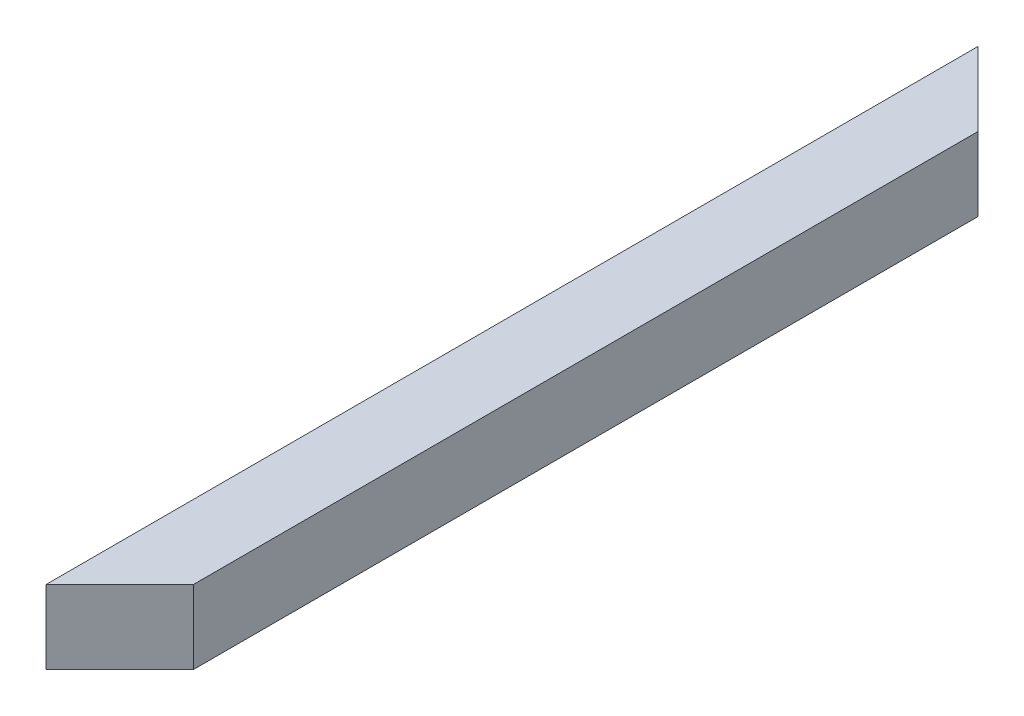
ISO-10303-21;
HEADER;
FILE_DESCRIPTION(('STEP AP214'),'2;1');
FILE_NAME('part.step','',(''),(''),'','','');
FILE_SCHEMA(('AUTOMOTIVE_DESIGN { 1 0 10303 214 1 1 1 1 }'));
ENDSEC;
DATA;
#1=APPLICATION_CONTEXT('core data for automotive mechanical design processes');
#2=APPLICATION_PROTOCOL_DEFINITION('international standard','automotive_design',2000,#1);
#3=PRODUCT_CONTEXT('',#1,'mechanical');
#4=PRODUCT('Part','Part','',(#3));
#5=PRODUCT_RELATED_PRODUCT_CATEGORY('part','',(#4));
#6=PRODUCT_DEFINITION_FORMATION('','',#4);
#7=PRODUCT_DEFINITION_CONTEXT('part definition',#1,'design');
#8=PRODUCT_DEFINITION('design','',#6,#7);
#9=PRODUCT_DEFINITION_SHAPE('','',#8);
#10=(LENGTH_UNIT() NAMED_UNIT(*) SI_UNIT(.MILLI.,.METRE.));
#11=(NAMED_UNIT(*) PLANE_ANGLE_UNIT() SI_UNIT($,.RADIAN.));
#12=(NAMED_UNIT(*) SI_UNIT($,.STERADIAN.) SOLID_ANGLE_UNIT());
#13=UNCERTAINTY_MEASURE_WITH_UNIT(LENGTH_MEASURE(1.E-05),#10,'distance_accuracy_value','');
#14=(GEOMETRIC_REPRESENTATION_CONTEXT(3) GLOBAL_UNCERTAINTY_ASSIGNED_CONTEXT((#13)) GLOBAL_UNIT_ASSIGNED_CONTEXT((#10,
#11,#12)) REPRESENTATION_CONTEXT('',''));
#15=CARTESIAN_POINT('',(0.,0.,0.));
#16=DIRECTION('',(0.,0.,1.));
#17=DIRECTION('',(1.,0.,0.));
#18=AXIS2_PLACEMENT_3D('',#15,#16,#17);
#19=CARTESIAN_POINT('',(-239.70919882224,8.99999999999999,135.572113832392));
#20=DIRECTION('',(1.,0.,0.));
#21=DIRECTION('',(0.,0.,-1.));
#22=AXIS2_PLACEMENT_3D('',#19,#20,#21);
#23=PLANE('',#22);
#24=DIRECTION('',(0.,-1.,0.));
#25=VECTOR('',#24,1.);
#26=CARTESIAN_POINT('',(-239.70919882224,8.99999999999999,113.844191771034));
#27=LINE('',#26,#25);
#28=CARTESIAN_POINT('',(-239.70919882224,9.00000000000001,113.844191771034));
#29=VERTEX_POINT('',#28);
#30=CARTESIAN_POINT('',(-239.70919882224,-8.99999999999999,113.844191771034));
#31=VERTEX_POINT('',#30);
#32=EDGE_CURVE('E47',#29,#31,#27,.T.);
#33=ORIENTED_EDGE('',*,*,#32,.F.);
#34=DIRECTION('',(0.,0.,-1.));
#35=VECTOR('',#34,1.);
#36=CARTESIAN_POINT('',(-239.70919882224,8.99999999999999,135.572113832392));
#37=LINE('',#36,#35);
#38=CARTESIAN_POINT('',(-239.70919882224,8.9999999999999,-113.844191771034));
#39=VERTEX_POINT('',#38);
#40=EDGE_CURVE('E101',#29,#39,#37,.T.);
#41=ORIENTED_EDGE('',*,*,#40,.T.);
#42=DIRECTION('',(0.,-1.,0.));
#43=VECTOR('',#42,1.);
#44=CARTESIAN_POINT('',(-239.70919882224,9.00000000000009,-113.844191771034));
#45=LINE('',#44,#43);
#46=CARTESIAN_POINT('',(-239.70919882224,-9.00000000000006,-113.844191771034));
#47=VERTEX_POINT('',#46);
#48=EDGE_CURVE('E99',#39,#47,#45,.T.);
#49=ORIENTED_EDGE('',*,*,#48,.T.);
#50=DIRECTION('',(0.,0.,-1.));
#51=VECTOR('',#50,1.);
#52=CARTESIAN_POINT('',(-239.70919882224,-8.99999999999999,135.572113832392));
#53=LINE('',#52,#51);
#54=EDGE_CURVE('E82',#31,#47,#53,.T.);
#55=ORIENTED_EDGE('',*,*,#54,.F.);
#56=EDGE_LOOP('',(#33,#41,#49,#55));
#57=FACE_BOUND('',#56,.T.);
#58=ADVANCED_FACE('F37',(#57),#23,.F.);
#59=CARTESIAN_POINT('',(-221.70919882224,-8.99999999999999,135.572113832392));
#60=DIRECTION('',(0.,1.,0.));
#61=DIRECTION('',(0.,0.,1.));
#62=AXIS2_PLACEMENT_3D('',#59,#60,#61);
#63=PLANE('',#62);
#64=DIRECTION('',(0.707106781186548,0.,-0.707106781186547));
#65=VECTOR('',#64,1.);
#66=CARTESIAN_POINT('',(-241.573159852919,-8.99999999999999,115.708152801713));
#67=LINE('',#66,#65);
#68=CARTESIAN_POINT('',(-221.70919882224,-8.99999999999999,95.8441917710343));
#69=VERTEX_POINT('',#68);
#70=EDGE_CURVE('E11',#31,#69,#67,.T.);
#71=ORIENTED_EDGE('',*,*,#70,.F.);
#72=ORIENTED_EDGE('',*,*,#54,.T.);
#73=DIRECTION('',(0.707106781186548,0.,0.707106781186547));
#74=VECTOR('',#73,1.);
#75=CARTESIAN_POINT('',(-241.573159852919,-8.99999999999999,-115.708152801713));
#76=LINE('',#75,#74);
#77=CARTESIAN_POINT('',(-221.70919882224,-8.99999999999999,-95.844191771034));
#78=VERTEX_POINT('',#77);
#79=EDGE_CURVE('E89',#47,#78,#76,.T.);
#80=ORIENTED_EDGE('',*,*,#79,.T.);
#81=DIRECTION('',(0.,0.,-1.));
#82=VECTOR('',#81,1.);
#83=CARTESIAN_POINT('',(-221.70919882224,-8.99999999999999,135.572113832392));
#84=LINE('',#83,#82);
#85=EDGE_CURVE('E74',#69,#78,#84,.T.);
#86=ORIENTED_EDGE('',*,*,#85,.F.);
#87=EDGE_LOOP('',(#71,#72,#80,#86));
#88=FACE_BOUND('',#87,.T.);
#89=ADVANCED_FACE('F94',(#88),#63,.F.);
#90=CARTESIAN_POINT('',(-221.70919882224,8.99999999999999,135.572113832392));
#91=DIRECTION('',(-1.,0.,0.));
#92=DIRECTION('',(0.,0.,1.));
#93=AXIS2_PLACEMENT_3D('',#90,#91,#92);
#94=PLANE('',#93);
#95=DIRECTION('',(0.,1.,0.));
#96=VECTOR('',#95,1.);
#97=CARTESIAN_POINT('',(-221.70919882224,8.99999999999999,95.8441917710343));
#98=LINE('',#97,#96);
#99=CARTESIAN_POINT('',(-221.70919882224,8.99999999999999,95.8441917710343));
#100=VERTEX_POINT('',#99);
#101=EDGE_CURVE('E41',#69,#100,#98,.T.);
#102=ORIENTED_EDGE('',*,*,#101,.F.);
#103=ORIENTED_EDGE('',*,*,#85,.T.);
#104=DIRECTION('',(0.,1.,0.));
#105=VECTOR('',#104,1.);
#106=CARTESIAN_POINT('',(-221.70919882224,9.00000000000017,-95.8441917710341));
#107=LINE('',#106,#105);
#108=CARTESIAN_POINT('',(-221.70919882224,8.9999999999999,-95.8441917710341));
#109=VERTEX_POINT('',#108);
#110=EDGE_CURVE('E78',#78,#109,#107,.T.);
#111=ORIENTED_EDGE('',*,*,#110,.T.);
#112=DIRECTION('',(0.,0.,-1.));
#113=VECTOR('',#112,1.);
#114=CARTESIAN_POINT('',(-221.70919882224,8.99999999999999,135.572113832392));
#115=LINE('',#114,#113);
#116=EDGE_CURVE('E81',#100,#109,#115,.T.);
#117=ORIENTED_EDGE('',*,*,#116,.F.);
#118=EDGE_LOOP('',(#102,#103,#111,#117));
#119=FACE_BOUND('',#118,.T.);
#120=ADVANCED_FACE('F76',(#119),#94,.F.);
#121=CARTESIAN_POINT('',(-221.70919882224,8.99999999999999,135.572113832392));
#122=DIRECTION('',(0.,-1.,0.));
#123=DIRECTION('',(0.,0.,-1.));
#124=AXIS2_PLACEMENT_3D('',#121,#122,#123);
#125=PLANE('',#124);
#126=DIRECTION('',(-0.707106781186548,0.,0.707106781186547));
#127=VECTOR('',#126,1.);
#128=CARTESIAN_POINT('',(-241.573159852919,8.99999999999999,115.708152801713));
#129=LINE('',#128,#127);
#130=EDGE_CURVE('E102',#100,#29,#129,.T.);
#131=ORIENTED_EDGE('',*,*,#130,.F.);
#132=ORIENTED_EDGE('',*,*,#116,.T.);
#133=DIRECTION('',(-0.707106781186548,0.,-0.707106781186547));
#134=VECTOR('',#133,1.);
#135=CARTESIAN_POINT('',(-241.573159852919,8.99999999999999,-115.708152801713));
#136=LINE('',#135,#134);
#137=EDGE_CURVE('E92',#109,#39,#136,.T.);
#138=ORIENTED_EDGE('',*,*,#137,.T.);
#139=ORIENTED_EDGE('',*,*,#40,.F.);
#140=EDGE_LOOP('',(#131,#132,#138,#139));
#141=FACE_BOUND('',#140,.T.);
#142=ADVANCED_FACE('F111',(#141),#125,.F.);
#143=CARTESIAN_POINT('',(-239.70919882224,-8.99999999999999,113.844191771034));
#144=DIRECTION('',(0.707106781186547,0.,0.707106781186548));
#145=DIRECTION('',(0.707106781186547,0.,-0.707106781186548));
#146=AXIS2_PLACEMENT_3D('',#143,#144,#145);
#147=PLANE('',#146);
#148=ORIENTED_EDGE('',*,*,#101,.T.);
#149=ORIENTED_EDGE('',*,*,#130,.T.);
#150=ORIENTED_EDGE('',*,*,#32,.T.);
#151=ORIENTED_EDGE('',*,*,#70,.T.);
#152=EDGE_LOOP('',(#148,#149,#150,#151));
#153=FACE_BOUND('',#152,.T.);
#154=ADVANCED_FACE('F39',(#153),#147,.T.);
#155=CARTESIAN_POINT('',(-239.70919882224,-9.00000000000006,-113.844191771034));
#156=DIRECTION('',(0.707106781186547,0.,-0.707106781186547));
#157=DIRECTION('',(0.,-1.,0.));
#158=AXIS2_PLACEMENT_3D('',#155,#156,#157);
#159=PLANE('',#158);
#160=ORIENTED_EDGE('',*,*,#79,.F.);
#161=ORIENTED_EDGE('',*,*,#48,.F.);
#162=ORIENTED_EDGE('',*,*,#137,.F.);
#163=ORIENTED_EDGE('',*,*,#110,.F.);
#164=EDGE_LOOP('',(#160,#161,#162,#163));
#165=FACE_BOUND('',#164,.T.);
#166=ADVANCED_FACE('F87',(#165),#159,.T.);
#167=CLOSED_SHELL('',(#58,#89,#120,#142,#154,#166));
#168=MANIFOLD_SOLID_BREP('B2',#167);
#169=ADVANCED_BREP_SHAPE_REPRESENTATION('',(#18,#168),#14);
#170=SHAPE_DEFINITION_REPRESENTATION(#9,#169);
ENDSEC;
END-ISO-10303-21;
